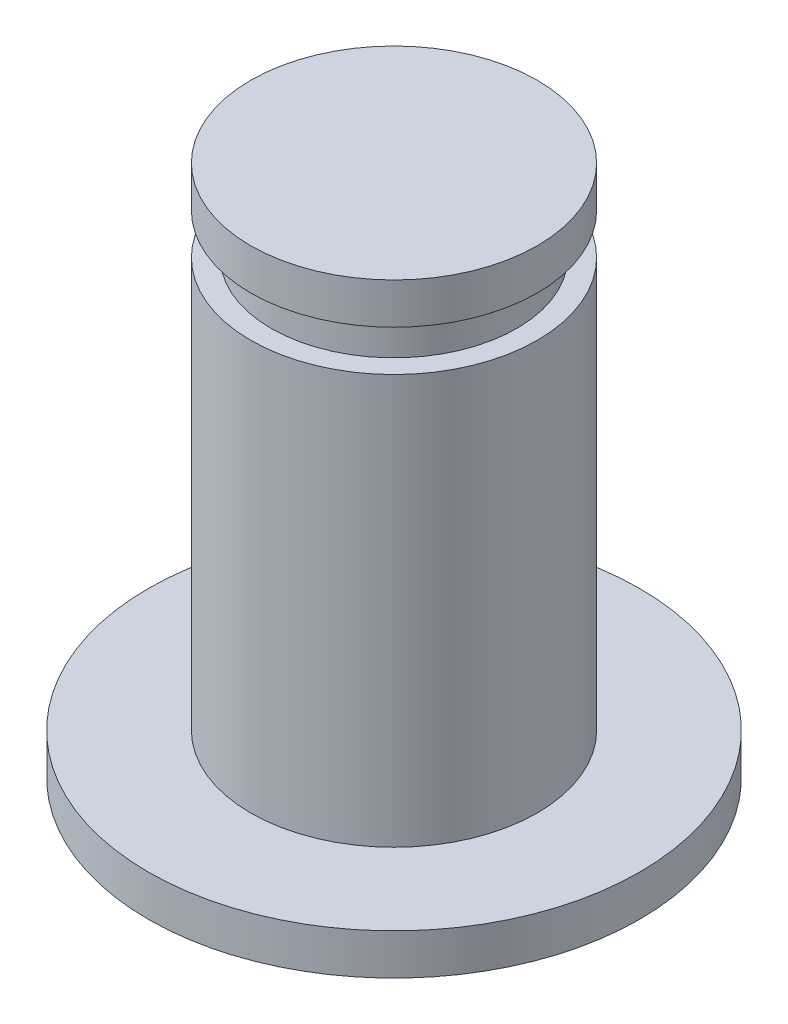
ISO-10303-21;
HEADER;
FILE_DESCRIPTION(('STEP AP214'),'2;1');
FILE_NAME('part.step','',(''),(''),'','','');
FILE_SCHEMA(('AUTOMOTIVE_DESIGN { 1 0 10303 214 1 1 1 1 }'));
ENDSEC;
DATA;
#1=APPLICATION_CONTEXT('core data for automotive mechanical design processes');
#2=APPLICATION_PROTOCOL_DEFINITION('international standard','automotive_design',2000,#1);
#3=PRODUCT_CONTEXT('',#1,'mechanical');
#4=PRODUCT('Part','Part','',(#3));
#5=PRODUCT_RELATED_PRODUCT_CATEGORY('part','',(#4));
#6=PRODUCT_DEFINITION_FORMATION('','',#4);
#7=PRODUCT_DEFINITION_CONTEXT('part definition',#1,'design');
#8=PRODUCT_DEFINITION('design','',#6,#7);
#9=PRODUCT_DEFINITION_SHAPE('','',#8);
#10=(LENGTH_UNIT() NAMED_UNIT(*) SI_UNIT(.MILLI.,.METRE.));
#11=(NAMED_UNIT(*) PLANE_ANGLE_UNIT() SI_UNIT($,.RADIAN.));
#12=(NAMED_UNIT(*) SI_UNIT($,.STERADIAN.) SOLID_ANGLE_UNIT());
#13=UNCERTAINTY_MEASURE_WITH_UNIT(LENGTH_MEASURE(1.E-05),#10,'distance_accuracy_value','');
#14=(GEOMETRIC_REPRESENTATION_CONTEXT(3) GLOBAL_UNCERTAINTY_ASSIGNED_CONTEXT((#13)) GLOBAL_UNIT_ASSIGNED_CONTEXT((#10,
#11,#12)) REPRESENTATION_CONTEXT('',''));
#15=CARTESIAN_POINT('',(0.,0.,0.));
#16=DIRECTION('',(0.,0.,1.));
#17=DIRECTION('',(1.,0.,0.));
#18=AXIS2_PLACEMENT_3D('',#15,#16,#17);
#19=CARTESIAN_POINT('',(0.,13.,0.));
#20=DIRECTION('',(0.,-1.,0.));
#21=DIRECTION('',(0.,0.,-1.));
#22=AXIS2_PLACEMENT_3D('',#19,#20,#21);
#23=CYLINDRICAL_SURFACE('',#22,3.5);
#24=CARTESIAN_POINT('',(0.,1.,0.));
#25=DIRECTION('',(0.,1.,0.));
#26=DIRECTION('',(0.,0.,1.));
#27=AXIS2_PLACEMENT_3D('',#24,#25,#26);
#28=CIRCLE('',#27,3.5);
#29=CARTESIAN_POINT('',(0.,1.,3.5));
#30=VERTEX_POINT('',#29);
#31=EDGE_CURVE('E10',#30,#30,#28,.T.);
#32=ORIENTED_EDGE('',*,*,#31,.T.);
#33=EDGE_LOOP('',(#32));
#34=FACE_BOUND('',#33,.T.);
#35=CARTESIAN_POINT('',(0.,11.,0.));
#36=DIRECTION('',(0.,1.,0.));
#37=DIRECTION('',(0.,0.,1.));
#38=AXIS2_PLACEMENT_3D('',#35,#36,#37);
#39=CIRCLE('',#38,3.5);
#40=CARTESIAN_POINT('',(0.,11.,3.5));
#41=VERTEX_POINT('',#40);
#42=EDGE_CURVE('E57',#41,#41,#39,.T.);
#43=ORIENTED_EDGE('',*,*,#42,.F.);
#44=EDGE_LOOP('',(#43));
#45=FACE_BOUND('',#44,.T.);
#46=ADVANCED_FACE('F37',(#34,#45),#23,.T.);
#47=CARTESIAN_POINT('',(0.,1.,0.));
#48=DIRECTION('',(0.,-1.,0.));
#49=DIRECTION('',(0.,0.,-1.));
#50=AXIS2_PLACEMENT_3D('',#47,#48,#49);
#51=CYLINDRICAL_SURFACE('',#50,6.);
#52=CARTESIAN_POINT('',(0.,1.,0.));
#53=DIRECTION('',(0.,1.,0.));
#54=DIRECTION('',(0.,0.,1.));
#55=AXIS2_PLACEMENT_3D('',#52,#53,#54);
#56=CIRCLE('',#55,6.);
#57=CARTESIAN_POINT('',(0.,1.,6.));
#58=VERTEX_POINT('',#57);
#59=EDGE_CURVE('E46',#58,#58,#56,.T.);
#60=ORIENTED_EDGE('',*,*,#59,.F.);
#61=EDGE_LOOP('',(#60));
#62=FACE_BOUND('',#61,.T.);
#63=CARTESIAN_POINT('',(0.,0.,0.));
#64=DIRECTION('',(0.,1.,0.));
#65=DIRECTION('',(0.,0.,1.));
#66=AXIS2_PLACEMENT_3D('',#63,#64,#65);
#67=CIRCLE('',#66,6.);
#68=CARTESIAN_POINT('',(0.,0.,6.));
#69=VERTEX_POINT('',#68);
#70=EDGE_CURVE('E41',#69,#69,#67,.T.);
#71=ORIENTED_EDGE('',*,*,#70,.T.);
#72=EDGE_LOOP('',(#71));
#73=FACE_BOUND('',#72,.T.);
#74=ADVANCED_FACE('F39',(#62,#73),#51,.T.);
#75=CARTESIAN_POINT('',(0.,1.,0.));
#76=DIRECTION('',(0.,1.,0.));
#77=DIRECTION('',(0.,0.,1.));
#78=AXIS2_PLACEMENT_3D('',#75,#76,#77);
#79=PLANE('',#78);
#80=ORIENTED_EDGE('',*,*,#31,.F.);
#81=EDGE_LOOP('',(#80));
#82=FACE_BOUND('',#81,.T.);
#83=ORIENTED_EDGE('',*,*,#59,.T.);
#84=EDGE_LOOP('',(#83));
#85=FACE_BOUND('',#84,.T.);
#86=ADVANCED_FACE('F91',(#82,#85),#79,.T.);
#87=CARTESIAN_POINT('',(0.,0.,0.));
#88=DIRECTION('',(0.,1.,0.));
#89=DIRECTION('',(0.,0.,1.));
#90=AXIS2_PLACEMENT_3D('',#87,#88,#89);
#91=PLANE('',#90);
#92=ORIENTED_EDGE('',*,*,#70,.F.);
#93=EDGE_LOOP('',(#92));
#94=FACE_BOUND('',#93,.T.);
#95=ADVANCED_FACE('F81',(#94),#91,.F.);
#96=CARTESIAN_POINT('',(0.,11.,0.));
#97=DIRECTION('',(0.,1.,0.));
#98=DIRECTION('',(0.,0.,1.));
#99=AXIS2_PLACEMENT_3D('',#96,#97,#98);
#100=PLANE('',#99);
#101=CARTESIAN_POINT('',(0.,11.,0.));
#102=DIRECTION('',(0.,1.,0.));
#103=DIRECTION('',(0.,0.,1.));
#104=AXIS2_PLACEMENT_3D('',#101,#102,#103);
#105=CIRCLE('',#104,3.);
#106=CARTESIAN_POINT('',(0.,11.,3.));
#107=VERTEX_POINT('',#106);
#108=EDGE_CURVE('E62',#107,#107,#105,.T.);
#109=ORIENTED_EDGE('',*,*,#108,.F.);
#110=EDGE_LOOP('',(#109));
#111=FACE_BOUND('',#110,.T.);
#112=ORIENTED_EDGE('',*,*,#42,.T.);
#113=EDGE_LOOP('',(#112));
#114=FACE_BOUND('',#113,.T.);
#115=ADVANCED_FACE('F77',(#111,#114),#100,.T.);
#116=CARTESIAN_POINT('',(0.,12.,0.));
#117=DIRECTION('',(0.,1.,0.));
#118=DIRECTION('',(0.,0.,1.));
#119=AXIS2_PLACEMENT_3D('',#116,#117,#118);
#120=PLANE('',#119);
#121=CARTESIAN_POINT('',(0.,12.,0.));
#122=DIRECTION('',(0.,1.,0.));
#123=DIRECTION('',(0.,0.,1.));
#124=AXIS2_PLACEMENT_3D('',#121,#122,#123);
#125=CIRCLE('',#124,3.);
#126=CARTESIAN_POINT('',(0.,12.,3.));
#127=VERTEX_POINT('',#126);
#128=EDGE_CURVE('E66',#127,#127,#125,.T.);
#129=ORIENTED_EDGE('',*,*,#128,.T.);
#130=EDGE_LOOP('',(#129));
#131=FACE_BOUND('',#130,.T.);
#132=CARTESIAN_POINT('',(0.,12.,0.));
#133=DIRECTION('',(0.,1.,0.));
#134=DIRECTION('',(0.,0.,1.));
#135=AXIS2_PLACEMENT_3D('',#132,#133,#134);
#136=CIRCLE('',#135,3.5);
#137=CARTESIAN_POINT('',(0.,12.,3.5));
#138=VERTEX_POINT('',#137);
#139=EDGE_CURVE('E58',#138,#138,#136,.T.);
#140=ORIENTED_EDGE('',*,*,#139,.F.);
#141=EDGE_LOOP('',(#140));
#142=FACE_BOUND('',#141,.T.);
#143=ADVANCED_FACE('F80',(#131,#142),#120,.F.);
#144=CARTESIAN_POINT('',(0.,11.,0.));
#145=DIRECTION('',(0.,1.,0.));
#146=DIRECTION('',(0.,0.,1.));
#147=AXIS2_PLACEMENT_3D('',#144,#145,#146);
#148=CYLINDRICAL_SURFACE('',#147,3.);
#149=ORIENTED_EDGE('',*,*,#108,.T.);
#150=EDGE_LOOP('',(#149));
#151=FACE_BOUND('',#150,.T.);
#152=ORIENTED_EDGE('',*,*,#128,.F.);
#153=EDGE_LOOP('',(#152));
#154=FACE_BOUND('',#153,.T.);
#155=ADVANCED_FACE('F74',(#151,#154),#148,.T.);
#156=CARTESIAN_POINT('',(0.,13.,0.));
#157=DIRECTION('',(0.,1.,0.));
#158=DIRECTION('',(0.,0.,1.));
#159=AXIS2_PLACEMENT_3D('',#156,#157,#158);
#160=PLANE('',#159);
#161=CARTESIAN_POINT('',(0.,13.,0.));
#162=DIRECTION('',(0.,1.,0.));
#163=DIRECTION('',(0.,0.,1.));
#164=AXIS2_PLACEMENT_3D('',#161,#162,#163);
#165=CIRCLE('',#164,3.5);
#166=CARTESIAN_POINT('',(0.,13.,3.5));
#167=VERTEX_POINT('',#166);
#168=EDGE_CURVE('E53',#167,#167,#165,.T.);
#169=ORIENTED_EDGE('',*,*,#168,.T.);
#170=EDGE_LOOP('',(#169));
#171=FACE_BOUND('',#170,.T.);
#172=ADVANCED_FACE('F96',(#171),#160,.T.);
#173=ORIENTED_EDGE('',*,*,#139,.T.);
#174=EDGE_LOOP('',(#173));
#175=FACE_BOUND('',#174,.T.);
#176=ORIENTED_EDGE('',*,*,#168,.F.);
#177=EDGE_LOOP('',(#176));
#178=FACE_BOUND('',#177,.T.);
#179=ADVANCED_FACE('F87',(#175,#178),#23,.T.);
#180=CLOSED_SHELL('',(#46,#74,#86,#95,#115,#143,#155,#172,#179));
#181=MANIFOLD_SOLID_BREP('B2',#180);
#182=ADVANCED_BREP_SHAPE_REPRESENTATION('',(#18,#181),#14);
#183=SHAPE_DEFINITION_REPRESENTATION(#9,#182);
ENDSEC;
END-ISO-10303-21;
